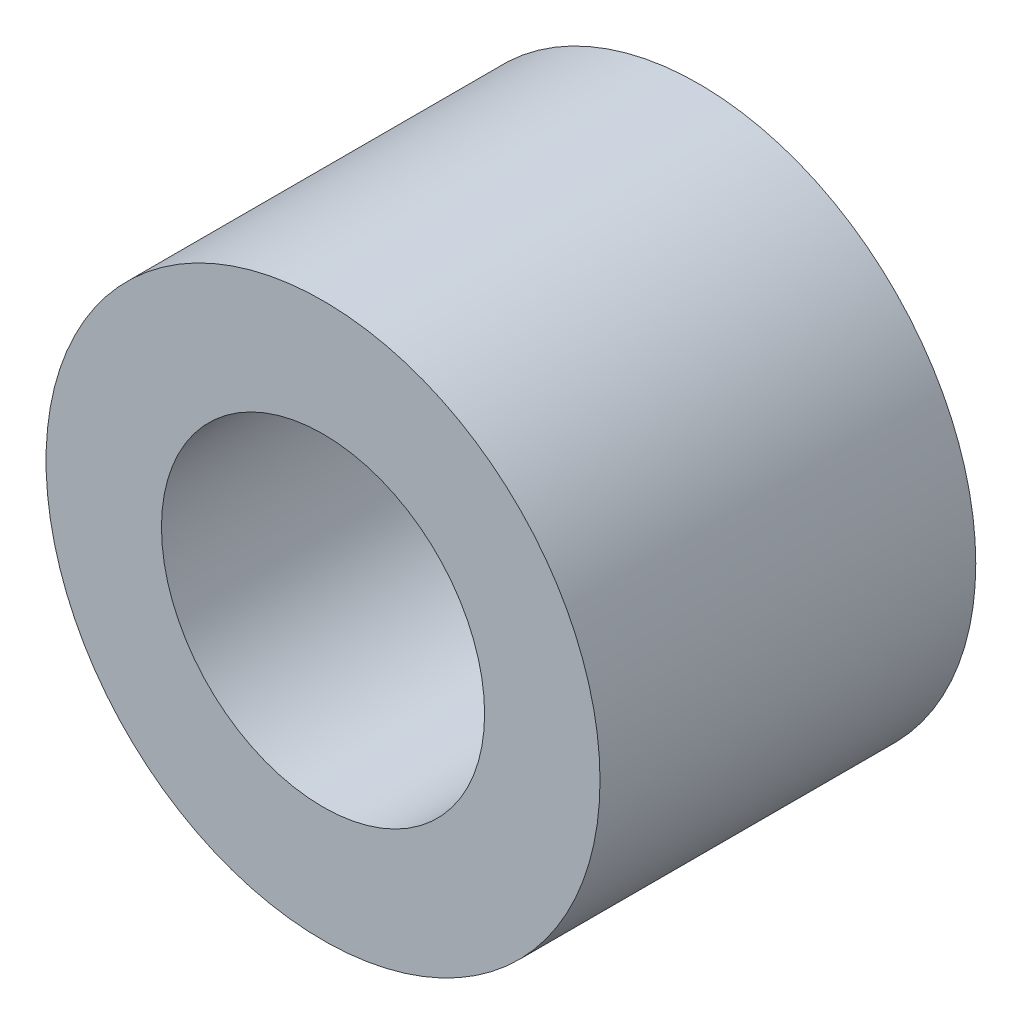
ISO-10303-21;
HEADER;
FILE_DESCRIPTION(('STEP AP214'),'2;1');
FILE_NAME('part.step','',(''),(''),'','','');
FILE_SCHEMA(('AUTOMOTIVE_DESIGN { 1 0 10303 214 1 1 1 1 }'));
ENDSEC;
DATA;
#1=APPLICATION_CONTEXT('core data for automotive mechanical design processes');
#2=APPLICATION_PROTOCOL_DEFINITION('international standard','automotive_design',2000,#1);
#3=PRODUCT_CONTEXT('',#1,'mechanical');
#4=PRODUCT('Part','Part','',(#3));
#5=PRODUCT_RELATED_PRODUCT_CATEGORY('part','',(#4));
#6=PRODUCT_DEFINITION_FORMATION('','',#4);
#7=PRODUCT_DEFINITION_CONTEXT('part definition',#1,'design');
#8=PRODUCT_DEFINITION('design','',#6,#7);
#9=PRODUCT_DEFINITION_SHAPE('','',#8);
#10=(LENGTH_UNIT() NAMED_UNIT(*) SI_UNIT(.MILLI.,.METRE.));
#11=(NAMED_UNIT(*) PLANE_ANGLE_UNIT() SI_UNIT($,.RADIAN.));
#12=(NAMED_UNIT(*) SI_UNIT($,.STERADIAN.) SOLID_ANGLE_UNIT());
#13=UNCERTAINTY_MEASURE_WITH_UNIT(LENGTH_MEASURE(1.E-05),#10,'distance_accuracy_value','');
#14=(GEOMETRIC_REPRESENTATION_CONTEXT(3) GLOBAL_UNCERTAINTY_ASSIGNED_CONTEXT((#13)) GLOBAL_UNIT_ASSIGNED_CONTEXT((#10,
#11,#12)) REPRESENTATION_CONTEXT('',''));
#15=CARTESIAN_POINT('',(0.,0.,0.));
#16=DIRECTION('',(0.,0.,1.));
#17=DIRECTION('',(1.,0.,0.));
#18=AXIS2_PLACEMENT_3D('',#15,#16,#17);
#19=CARTESIAN_POINT('',(0.,0.,41.35000112));
#20=DIRECTION('',(0.,0.,1.));
#21=DIRECTION('',(1.,0.,0.));
#22=AXIS2_PLACEMENT_3D('',#19,#20,#21);
#23=PLANE('',#22);
#24=CARTESIAN_POINT('',(0.,0.,41.35000112));
#25=DIRECTION('',(0.,0.,1.));
#26=DIRECTION('',(1.,0.,0.));
#27=AXIS2_PLACEMENT_3D('',#24,#25,#26);
#28=CIRCLE('',#27,30.48);
#29=CARTESIAN_POINT('',(30.48,0.,41.35000112));
#30=VERTEX_POINT('',#29);
#31=EDGE_CURVE('E10',#30,#30,#28,.T.);
#32=ORIENTED_EDGE('',*,*,#31,.T.);
#33=EDGE_LOOP('',(#32));
#34=FACE_BOUND('',#33,.T.);
#35=CARTESIAN_POINT('',(0.,0.,41.35000112));
#36=DIRECTION('',(0.,0.,1.));
#37=DIRECTION('',(1.,0.,0.));
#38=AXIS2_PLACEMENT_3D('',#35,#36,#37);
#39=CIRCLE('',#38,17.78);
#40=CARTESIAN_POINT('',(17.78,0.,41.35000112));
#41=VERTEX_POINT('',#40);
#42=EDGE_CURVE('E50',#41,#41,#39,.T.);
#43=ORIENTED_EDGE('',*,*,#42,.F.);
#44=EDGE_LOOP('',(#43));
#45=FACE_BOUND('',#44,.T.);
#46=ADVANCED_FACE('F37',(#34,#45),#23,.T.);
#47=CARTESIAN_POINT('',(0.,0.,0.));
#48=DIRECTION('',(0.,0.,1.));
#49=DIRECTION('',(1.,0.,0.));
#50=AXIS2_PLACEMENT_3D('',#47,#48,#49);
#51=PLANE('',#50);
#52=CARTESIAN_POINT('',(0.,0.,0.));
#53=DIRECTION('',(0.,0.,1.));
#54=DIRECTION('',(1.,0.,0.));
#55=AXIS2_PLACEMENT_3D('',#52,#53,#54);
#56=CIRCLE('',#55,30.48);
#57=CARTESIAN_POINT('',(30.48,0.,0.));
#58=VERTEX_POINT('',#57);
#59=EDGE_CURVE('E41',#58,#58,#56,.T.);
#60=ORIENTED_EDGE('',*,*,#59,.F.);
#61=EDGE_LOOP('',(#60));
#62=FACE_BOUND('',#61,.T.);
#63=CARTESIAN_POINT('',(0.,0.,0.));
#64=DIRECTION('',(0.,0.,1.));
#65=DIRECTION('',(1.,0.,0.));
#66=AXIS2_PLACEMENT_3D('',#63,#64,#65);
#67=CIRCLE('',#66,17.78);
#68=CARTESIAN_POINT('',(17.78,0.,0.));
#69=VERTEX_POINT('',#68);
#70=EDGE_CURVE('E52',#69,#69,#67,.T.);
#71=ORIENTED_EDGE('',*,*,#70,.T.);
#72=EDGE_LOOP('',(#71));
#73=FACE_BOUND('',#72,.T.);
#74=ADVANCED_FACE('F64',(#62,#73),#51,.F.);
#75=CARTESIAN_POINT('',(0.,0.,41.35000112));
#76=DIRECTION('',(0.,0.,-1.));
#77=DIRECTION('',(-1.,0.,0.));
#78=AXIS2_PLACEMENT_3D('',#75,#76,#77);
#79=CYLINDRICAL_SURFACE('',#78,30.48);
#80=ORIENTED_EDGE('',*,*,#31,.F.);
#81=EDGE_LOOP('',(#80));
#82=FACE_BOUND('',#81,.T.);
#83=ORIENTED_EDGE('',*,*,#59,.T.);
#84=EDGE_LOOP('',(#83));
#85=FACE_BOUND('',#84,.T.);
#86=ADVANCED_FACE('F39',(#82,#85),#79,.T.);
#87=CARTESIAN_POINT('',(0.,0.,41.35000112));
#88=DIRECTION('',(0.,0.,-1.));
#89=DIRECTION('',(-1.,0.,0.));
#90=AXIS2_PLACEMENT_3D('',#87,#88,#89);
#91=CYLINDRICAL_SURFACE('',#90,17.78);
#92=ORIENTED_EDGE('',*,*,#42,.T.);
#93=EDGE_LOOP('',(#92));
#94=FACE_BOUND('',#93,.T.);
#95=ORIENTED_EDGE('',*,*,#70,.F.);
#96=EDGE_LOOP('',(#95));
#97=FACE_BOUND('',#96,.T.);
#98=ADVANCED_FACE('F60',(#94,#97),#91,.F.);
#99=CLOSED_SHELL('',(#46,#74,#86,#98));
#100=MANIFOLD_SOLID_BREP('B2',#99);
#101=ADVANCED_BREP_SHAPE_REPRESENTATION('',(#18,#100),#14);
#102=SHAPE_DEFINITION_REPRESENTATION(#9,#101);
ENDSEC;
END-ISO-10303-21;
